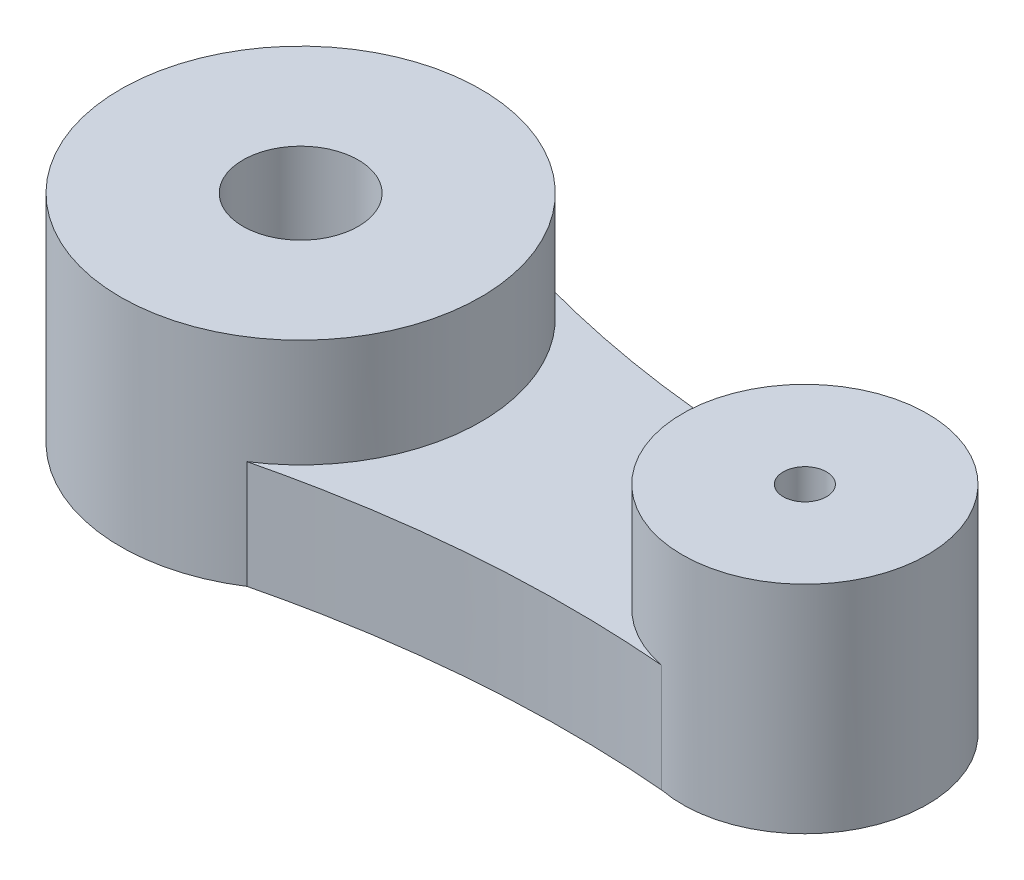
ISO-10303-21;
HEADER;
FILE_DESCRIPTION(('STEP AP214'),'2;1');
FILE_NAME('part.step','',(''),(''),'','','');
FILE_SCHEMA(('AUTOMOTIVE_DESIGN { 1 0 10303 214 1 1 1 1 }'));
ENDSEC;
DATA;
#1=APPLICATION_CONTEXT('core data for automotive mechanical design processes');
#2=APPLICATION_PROTOCOL_DEFINITION('international standard','automotive_design',2000,#1);
#3=PRODUCT_CONTEXT('',#1,'mechanical');
#4=PRODUCT('Part','Part','',(#3));
#5=PRODUCT_RELATED_PRODUCT_CATEGORY('part','',(#4));
#6=PRODUCT_DEFINITION_FORMATION('','',#4);
#7=PRODUCT_DEFINITION_CONTEXT('part definition',#1,'design');
#8=PRODUCT_DEFINITION('design','',#6,#7);
#9=PRODUCT_DEFINITION_SHAPE('','',#8);
#10=(LENGTH_UNIT() NAMED_UNIT(*) SI_UNIT(.MILLI.,.METRE.));
#11=(NAMED_UNIT(*) PLANE_ANGLE_UNIT() SI_UNIT($,.RADIAN.));
#12=(NAMED_UNIT(*) SI_UNIT($,.STERADIAN.) SOLID_ANGLE_UNIT());
#13=UNCERTAINTY_MEASURE_WITH_UNIT(LENGTH_MEASURE(1.E-05),#10,'distance_accuracy_value','');
#14=(GEOMETRIC_REPRESENTATION_CONTEXT(3) GLOBAL_UNCERTAINTY_ASSIGNED_CONTEXT((#13)) GLOBAL_UNIT_ASSIGNED_CONTEXT((#10,
#11,#12)) REPRESENTATION_CONTEXT('',''));
#15=CARTESIAN_POINT('',(0.,0.,0.));
#16=DIRECTION('',(0.,0.,1.));
#17=DIRECTION('',(1.,0.,0.));
#18=AXIS2_PLACEMENT_3D('',#15,#16,#17);
#19=CARTESIAN_POINT('',(0.,15.,0.));
#20=DIRECTION('',(0.,-1.,0.));
#21=DIRECTION('',(0.,0.,-1.));
#22=AXIS2_PLACEMENT_3D('',#19,#20,#21);
#23=CYLINDRICAL_SURFACE('',#22,12.5);
#24=CARTESIAN_POINT('',(0.,15.,0.));
#25=DIRECTION('',(0.,1.,0.));
#26=DIRECTION('',(0.,0.,1.));
#27=AXIS2_PLACEMENT_3D('',#24,#25,#26);
#28=CIRCLE('',#27,12.5);
#29=CARTESIAN_POINT('',(0.,15.,12.5));
#30=VERTEX_POINT('',#29);
#31=EDGE_CURVE('E11',#30,#30,#28,.T.);
#32=ORIENTED_EDGE('',*,*,#31,.F.);
#33=EDGE_LOOP('',(#32));
#34=FACE_BOUND('',#33,.T.);
#35=CARTESIAN_POINT('',(0.,7.5,0.));
#36=DIRECTION('',(0.,1.,0.));
#37=DIRECTION('',(0.,0.,-1.));
#38=AXIS2_PLACEMENT_3D('',#35,#36,#37);
#39=CIRCLE('',#38,12.5);
#40=CARTESIAN_POINT('',(6.77893907780912,7.5,10.5021895326333));
#41=VERTEX_POINT('',#40);
#42=CARTESIAN_POINT('',(6.77893907780912,7.5,-10.5021895326333));
#43=VERTEX_POINT('',#42);
#44=EDGE_CURVE('E64',#41,#43,#39,.T.);
#45=ORIENTED_EDGE('',*,*,#44,.T.);
#46=DIRECTION('',(0.,-1.,0.));
#47=VECTOR('',#46,1.);
#48=CARTESIAN_POINT('',(6.77893907780911,7.5,-10.5021895326333));
#49=LINE('',#48,#47);
#50=CARTESIAN_POINT('',(6.77893907780911,0.,-10.5021895326333));
#51=VERTEX_POINT('',#50);
#52=EDGE_CURVE('E260',#43,#51,#49,.T.);
#53=ORIENTED_EDGE('',*,*,#52,.T.);
#54=CARTESIAN_POINT('',(0.,0.,0.));
#55=DIRECTION('',(0.,1.,0.));
#56=DIRECTION('',(0.,0.,1.));
#57=AXIS2_PLACEMENT_3D('',#54,#55,#56);
#58=CIRCLE('',#57,12.5);
#59=CARTESIAN_POINT('',(6.77893907780912,0.,10.5021895326333));
#60=VERTEX_POINT('',#59);
#61=EDGE_CURVE('E47',#51,#60,#58,.T.);
#62=ORIENTED_EDGE('',*,*,#61,.T.);
#63=DIRECTION('',(0.,-1.,0.));
#64=VECTOR('',#63,1.);
#65=CARTESIAN_POINT('',(6.77893907780912,7.5,10.5021895326333));
#66=LINE('',#65,#64);
#67=EDGE_CURVE('E59',#41,#60,#66,.T.);
#68=ORIENTED_EDGE('',*,*,#67,.F.);
#69=EDGE_LOOP('',(#45,#53,#62,#68));
#70=FACE_BOUND('',#69,.T.);
#71=ADVANCED_FACE('F44',(#34,#70),#23,.T.);
#72=CARTESIAN_POINT('',(0.,15.,0.));
#73=DIRECTION('',(0.,1.,0.));
#74=DIRECTION('',(0.,0.,1.));
#75=AXIS2_PLACEMENT_3D('',#72,#73,#74);
#76=PLANE('',#75);
#77=CARTESIAN_POINT('',(0.,15.,0.));
#78=DIRECTION('',(0.,1.,0.));
#79=DIRECTION('',(0.,0.,1.));
#80=AXIS2_PLACEMENT_3D('',#77,#78,#79);
#81=CIRCLE('',#80,3.99999999999999);
#82=CARTESIAN_POINT('',(0.,15.,3.99999999999999));
#83=VERTEX_POINT('',#82);
#84=EDGE_CURVE('E244',#83,#83,#81,.T.);
#85=ORIENTED_EDGE('',*,*,#84,.F.);
#86=EDGE_LOOP('',(#85));
#87=FACE_BOUND('',#86,.T.);
#88=ORIENTED_EDGE('',*,*,#31,.T.);
#89=EDGE_LOOP('',(#88));
#90=FACE_BOUND('',#89,.T.);
#91=ADVANCED_FACE('F134',(#87,#90),#76,.T.);
#92=CARTESIAN_POINT('',(0.,0.,0.));
#93=DIRECTION('',(0.,1.,0.));
#94=DIRECTION('',(0.,0.,1.));
#95=AXIS2_PLACEMENT_3D('',#92,#93,#94);
#96=PLANE('',#95);
#97=CARTESIAN_POINT('',(35.,0.,0.));
#98=DIRECTION('',(0.,1.,0.));
#99=DIRECTION('',(0.,0.,1.));
#100=AXIS2_PLACEMENT_3D('',#97,#98,#99);
#101=CIRCLE('',#100,1.5);
#102=CARTESIAN_POINT('',(35.,0.,1.5));
#103=VERTEX_POINT('',#102);
#104=EDGE_CURVE('E248',#103,#103,#101,.T.);
#105=ORIENTED_EDGE('',*,*,#104,.T.);
#106=EDGE_LOOP('',(#105));
#107=FACE_BOUND('',#106,.T.);
#108=CARTESIAN_POINT('',(0.,0.,0.));
#109=DIRECTION('',(0.,1.,0.));
#110=DIRECTION('',(0.,0.,1.));
#111=AXIS2_PLACEMENT_3D('',#108,#109,#110);
#112=CIRCLE('',#111,4.);
#113=CARTESIAN_POINT('',(0.,0.,4.));
#114=VERTEX_POINT('',#113);
#115=EDGE_CURVE('E239',#114,#114,#112,.T.);
#116=ORIENTED_EDGE('',*,*,#115,.T.);
#117=EDGE_LOOP('',(#116));
#118=FACE_BOUND('',#117,.T.);
#119=ORIENTED_EDGE('',*,*,#61,.F.);
#120=CARTESIAN_POINT('',(6.77893907780912,0.,-10.5021895326333));
#121=CARTESIAN_POINT('',(20.0780701139765,0.,-6.87736251216738));
#122=CARTESIAN_POINT('',(32.9530224181026,0.,-8.24984137903327));
#123=B_SPLINE_CURVE_WITH_KNOTS('',2,(#120,#121,#122),.UNSPECIFIED.,.F.,.F.,(3,3),(0.,
0.617827195606495),.UNSPECIFIED.);
#124=CARTESIAN_POINT('',(32.9530224181026,0.,-8.24984137903326));
#125=VERTEX_POINT('',#124);
#126=EDGE_CURVE('E233',#51,#125,#123,.T.);
#127=ORIENTED_EDGE('',*,*,#126,.T.);
#128=CARTESIAN_POINT('',(35.,0.,0.));
#129=DIRECTION('',(0.,1.,0.));
#130=DIRECTION('',(0.,0.,1.));
#131=AXIS2_PLACEMENT_3D('',#128,#129,#130);
#132=CIRCLE('',#131,8.50000000000001);
#133=CARTESIAN_POINT('',(33.4112747408195,0.,8.3502067070727));
#134=VERTEX_POINT('',#133);
#135=EDGE_CURVE('E234',#134,#125,#132,.T.);
#136=ORIENTED_EDGE('',*,*,#135,.F.);
#137=CARTESIAN_POINT('',(33.4112747408195,0.,8.3502067070727));
#138=CARTESIAN_POINT('',(20.2255071541268,0.,7.23953667088592));
#139=CARTESIAN_POINT('',(6.77893907780912,0.,10.5021895326333));
#140=B_SPLINE_CURVE_WITH_KNOTS('',2,(#137,#138,#139),.UNSPECIFIED.,.F.,.F.,(3,3),(0.,
0.631379274317981),.UNSPECIFIED.);
#141=EDGE_CURVE('E97',#134,#60,#140,.T.);
#142=ORIENTED_EDGE('',*,*,#141,.T.);
#143=EDGE_LOOP('',(#119,#127,#136,#142));
#144=FACE_BOUND('',#143,.T.);
#145=ADVANCED_FACE('F132',(#107,#118,#144),#96,.F.);
#146=CARTESIAN_POINT('',(6.77893907780912,7.5,-10.5021895326333));
#147=CARTESIAN_POINT('',(20.0780701139765,7.5,-6.87736251216738));
#148=CARTESIAN_POINT('',(32.9530224181026,7.5,-8.24984137903327));
#149=B_SPLINE_CURVE_WITH_KNOTS('',2,(#146,#147,#148),.UNSPECIFIED.,.F.,.F.,(3,3),(0.,
0.617827195606495),.UNSPECIFIED.);
#150=DIRECTION('',(0.,-1.,0.));
#151=VECTOR('',#150,1.);
#152=SURFACE_OF_LINEAR_EXTRUSION('',#149,#151);
#153=ORIENTED_EDGE('',*,*,#126,.F.);
#154=ORIENTED_EDGE('',*,*,#52,.F.);
#155=CARTESIAN_POINT('',(32.9530224181026,7.5,-8.24984137903326));
#156=VERTEX_POINT('',#155);
#157=EDGE_CURVE('E108',#43,#156,#149,.T.);
#158=ORIENTED_EDGE('',*,*,#157,.T.);
#159=DIRECTION('',(0.,-1.,0.));
#160=VECTOR('',#159,1.);
#161=CARTESIAN_POINT('',(32.9530224181026,7.5,-8.24984137903326));
#162=LINE('',#161,#160);
#163=EDGE_CURVE('E102',#156,#125,#162,.T.);
#164=ORIENTED_EDGE('',*,*,#163,.T.);
#165=EDGE_LOOP('',(#153,#154,#158,#164));
#166=FACE_BOUND('',#165,.T.);
#167=ADVANCED_FACE('F128',(#166),#152,.T.);
#168=CARTESIAN_POINT('',(33.4112747408195,7.5,8.3502067070727));
#169=CARTESIAN_POINT('',(20.2255071541268,7.5,7.23953667088592));
#170=CARTESIAN_POINT('',(6.77893907780912,7.5,10.5021895326333));
#171=B_SPLINE_CURVE_WITH_KNOTS('',2,(#168,#169,#170),.UNSPECIFIED.,.F.,.F.,(3,3),(0.,
0.631379274317981),.UNSPECIFIED.);
#172=DIRECTION('',(0.,-1.,0.));
#173=VECTOR('',#172,1.);
#174=SURFACE_OF_LINEAR_EXTRUSION('',#171,#173);
#175=ORIENTED_EDGE('',*,*,#141,.F.);
#176=DIRECTION('',(0.,-1.,0.));
#177=VECTOR('',#176,1.);
#178=CARTESIAN_POINT('',(33.4112747408195,7.5,8.3502067070727));
#179=LINE('',#178,#177);
#180=CARTESIAN_POINT('',(33.4112747408195,7.5,8.35020670707271));
#181=VERTEX_POINT('',#180);
#182=EDGE_CURVE('E94',#181,#134,#179,.T.);
#183=ORIENTED_EDGE('',*,*,#182,.F.);
#184=EDGE_CURVE('E83',#181,#41,#171,.T.);
#185=ORIENTED_EDGE('',*,*,#184,.T.);
#186=ORIENTED_EDGE('',*,*,#67,.T.);
#187=EDGE_LOOP('',(#175,#183,#185,#186));
#188=FACE_BOUND('',#187,.T.);
#189=ADVANCED_FACE('F95',(#188),#174,.T.);
#190=CARTESIAN_POINT('',(19.9720254309662,7.5,-8.12668898400033));
#191=DIRECTION('',(0.,-1.,0.));
#192=DIRECTION('',(0.,0.,-1.));
#193=AXIS2_PLACEMENT_3D('',#190,#191,#192);
#194=PLANE('',#193);
#195=ORIENTED_EDGE('',*,*,#157,.F.);
#196=ORIENTED_EDGE('',*,*,#44,.F.);
#197=ORIENTED_EDGE('',*,*,#184,.F.);
#198=CARTESIAN_POINT('',(35.,7.5,0.));
#199=DIRECTION('',(0.,1.,0.));
#200=DIRECTION('',(0.,0.,1.));
#201=AXIS2_PLACEMENT_3D('',#198,#199,#200);
#202=CIRCLE('',#201,8.50000000000001);
#203=EDGE_CURVE('E88',#156,#181,#202,.T.);
#204=ORIENTED_EDGE('',*,*,#203,.F.);
#205=EDGE_LOOP('',(#195,#196,#197,#204));
#206=FACE_BOUND('',#205,.T.);
#207=ADVANCED_FACE('F86',(#206),#194,.F.);
#208=CARTESIAN_POINT('',(35.,15.,0.));
#209=DIRECTION('',(0.,-1.,0.));
#210=DIRECTION('',(0.,0.,-1.));
#211=AXIS2_PLACEMENT_3D('',#208,#209,#210);
#212=CYLINDRICAL_SURFACE('',#211,8.50000000000001);
#213=ORIENTED_EDGE('',*,*,#163,.F.);
#214=ORIENTED_EDGE('',*,*,#203,.T.);
#215=ORIENTED_EDGE('',*,*,#182,.T.);
#216=ORIENTED_EDGE('',*,*,#135,.T.);
#217=EDGE_LOOP('',(#213,#214,#215,#216));
#218=FACE_BOUND('',#217,.T.);
#219=CARTESIAN_POINT('',(35.,15.,0.));
#220=DIRECTION('',(0.,1.,0.));
#221=DIRECTION('',(0.,0.,1.));
#222=AXIS2_PLACEMENT_3D('',#219,#220,#221);
#223=CIRCLE('',#222,8.50000000000001);
#224=CARTESIAN_POINT('',(35.,15.,8.50000000000001));
#225=VERTEX_POINT('',#224);
#226=EDGE_CURVE('E231',#225,#225,#223,.T.);
#227=ORIENTED_EDGE('',*,*,#226,.F.);
#228=EDGE_LOOP('',(#227));
#229=FACE_BOUND('',#228,.T.);
#230=ADVANCED_FACE('F105',(#218,#229),#212,.T.);
#231=CARTESIAN_POINT('',(35.,15.,0.));
#232=DIRECTION('',(0.,1.,0.));
#233=DIRECTION('',(0.,0.,1.));
#234=AXIS2_PLACEMENT_3D('',#231,#232,#233);
#235=PLANE('',#234);
#236=CARTESIAN_POINT('',(35.,15.,0.));
#237=DIRECTION('',(0.,1.,0.));
#238=DIRECTION('',(0.,0.,1.));
#239=AXIS2_PLACEMENT_3D('',#236,#237,#238);
#240=CIRCLE('',#239,1.49999999999999);
#241=CARTESIAN_POINT('',(35.,15.,1.49999999999999));
#242=VERTEX_POINT('',#241);
#243=EDGE_CURVE('E228',#242,#242,#240,.T.);
#244=ORIENTED_EDGE('',*,*,#243,.F.);
#245=EDGE_LOOP('',(#244));
#246=FACE_BOUND('',#245,.T.);
#247=ORIENTED_EDGE('',*,*,#226,.T.);
#248=EDGE_LOOP('',(#247));
#249=FACE_BOUND('',#248,.T.);
#250=ADVANCED_FACE('F175',(#246,#249),#235,.T.);
#251=CARTESIAN_POINT('',(0.,15.,0.));
#252=DIRECTION('',(0.,1.,0.));
#253=DIRECTION('',(0.,0.,1.));
#254=AXIS2_PLACEMENT_3D('',#251,#252,#253);
#255=CYLINDRICAL_SURFACE('',#254,3.99999999999999);
#256=ORIENTED_EDGE('',*,*,#115,.F.);
#257=EDGE_LOOP('',(#256));
#258=FACE_BOUND('',#257,.T.);
#259=ORIENTED_EDGE('',*,*,#84,.T.);
#260=EDGE_LOOP('',(#259));
#261=FACE_BOUND('',#260,.T.);
#262=ADVANCED_FACE('F185',(#258,#261),#255,.F.);
#263=CARTESIAN_POINT('',(35.,15.,0.));
#264=DIRECTION('',(0.,1.,0.));
#265=DIRECTION('',(0.,0.,1.));
#266=AXIS2_PLACEMENT_3D('',#263,#264,#265);
#267=CYLINDRICAL_SURFACE('',#266,1.49999999999999);
#268=ORIENTED_EDGE('',*,*,#104,.F.);
#269=EDGE_LOOP('',(#268));
#270=FACE_BOUND('',#269,.T.);
#271=ORIENTED_EDGE('',*,*,#243,.T.);
#272=EDGE_LOOP('',(#271));
#273=FACE_BOUND('',#272,.T.);
#274=ADVANCED_FACE('F187',(#270,#273),#267,.F.);
#275=CLOSED_SHELL('',(#71,#91,#145,#167,#189,#207,#230,#250,#262,#274));
#276=MANIFOLD_SOLID_BREP('B2',#275);
#277=ADVANCED_BREP_SHAPE_REPRESENTATION('',(#18,#276),#14);
#278=SHAPE_DEFINITION_REPRESENTATION(#9,#277);
ENDSEC;
END-ISO-10303-21;
